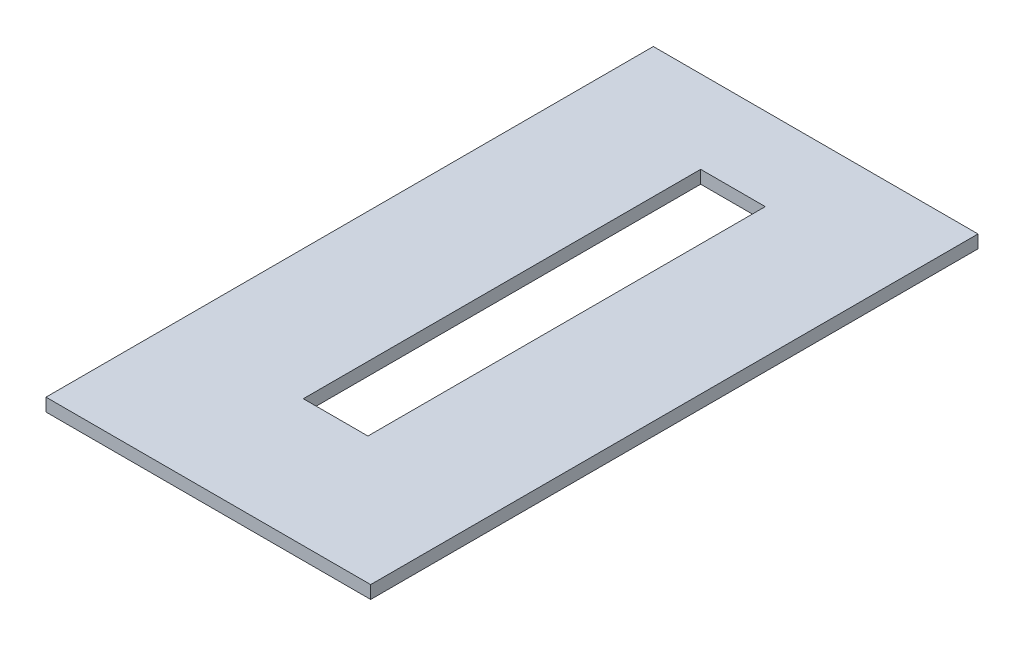
ISO-10303-21;
HEADER;
FILE_DESCRIPTION(('STEP AP214'),'2;1');
FILE_NAME('part.step','',(''),(''),'','','');
FILE_SCHEMA(('AUTOMOTIVE_DESIGN { 1 0 10303 214 1 1 1 1 }'));
ENDSEC;
DATA;
#1=APPLICATION_CONTEXT('core data for automotive mechanical design processes');
#2=APPLICATION_PROTOCOL_DEFINITION('international standard','automotive_design',2000,#1);
#3=PRODUCT_CONTEXT('',#1,'mechanical');
#4=PRODUCT('Part','Part','',(#3));
#5=PRODUCT_RELATED_PRODUCT_CATEGORY('part','',(#4));
#6=PRODUCT_DEFINITION_FORMATION('','',#4);
#7=PRODUCT_DEFINITION_CONTEXT('part definition',#1,'design');
#8=PRODUCT_DEFINITION('design','',#6,#7);
#9=PRODUCT_DEFINITION_SHAPE('','',#8);
#10=(LENGTH_UNIT() NAMED_UNIT(*) SI_UNIT(.MILLI.,.METRE.));
#11=(NAMED_UNIT(*) PLANE_ANGLE_UNIT() SI_UNIT($,.RADIAN.));
#12=(NAMED_UNIT(*) SI_UNIT($,.STERADIAN.) SOLID_ANGLE_UNIT());
#13=UNCERTAINTY_MEASURE_WITH_UNIT(LENGTH_MEASURE(1.E-05),#10,'distance_accuracy_value','');
#14=(GEOMETRIC_REPRESENTATION_CONTEXT(3) GLOBAL_UNCERTAINTY_ASSIGNED_CONTEXT((#13)) GLOBAL_UNIT_ASSIGNED_CONTEXT((#10,
#11,#12)) REPRESENTATION_CONTEXT('',''));
#15=CARTESIAN_POINT('',(0.,0.,0.));
#16=DIRECTION('',(0.,0.,1.));
#17=DIRECTION('',(1.,0.,0.));
#18=AXIS2_PLACEMENT_3D('',#15,#16,#17);
#19=CARTESIAN_POINT('',(-2512.49999999998,-200.,-4700.));
#20=DIRECTION('',(-1.,0.,0.));
#21=DIRECTION('',(0.,0.,1.));
#22=AXIS2_PLACEMENT_3D('',#19,#20,#21);
#23=PLANE('',#22);
#24=DIRECTION('',(0.,0.,1.));
#25=VECTOR('',#24,1.);
#26=CARTESIAN_POINT('',(-2512.49999999998,0.,-4700.));
#27=LINE('',#26,#25);
#28=CARTESIAN_POINT('',(-2512.49999999998,0.,-4700.));
#29=VERTEX_POINT('',#28);
#30=CARTESIAN_POINT('',(-2512.49999999998,0.,4700.));
#31=VERTEX_POINT('',#30);
#32=EDGE_CURVE('E148',#29,#31,#27,.T.);
#33=ORIENTED_EDGE('',*,*,#32,.F.);
#34=DIRECTION('',(0.,1.,0.));
#35=VECTOR('',#34,1.);
#36=CARTESIAN_POINT('',(-2512.49999999998,-200.,-4700.));
#37=LINE('',#36,#35);
#38=CARTESIAN_POINT('',(-2512.49999999998,-200.,-4700.));
#39=VERTEX_POINT('',#38);
#40=EDGE_CURVE('E11',#39,#29,#37,.T.);
#41=ORIENTED_EDGE('',*,*,#40,.F.);
#42=DIRECTION('',(0.,0.,1.));
#43=VECTOR('',#42,1.);
#44=CARTESIAN_POINT('',(-2512.49999999998,-200.,-4700.));
#45=LINE('',#44,#43);
#46=CARTESIAN_POINT('',(-2512.49999999998,-200.,4700.));
#47=VERTEX_POINT('',#46);
#48=EDGE_CURVE('E154',#39,#47,#45,.T.);
#49=ORIENTED_EDGE('',*,*,#48,.T.);
#50=DIRECTION('',(0.,1.,0.));
#51=VECTOR('',#50,1.);
#52=CARTESIAN_POINT('',(-2512.49999999998,-200.,4700.));
#53=LINE('',#52,#51);
#54=EDGE_CURVE('E41',#47,#31,#53,.T.);
#55=ORIENTED_EDGE('',*,*,#54,.T.);
#56=EDGE_LOOP('',(#33,#41,#49,#55));
#57=FACE_BOUND('',#56,.T.);
#58=ADVANCED_FACE('F38',(#57),#23,.T.);
#59=CARTESIAN_POINT('',(-2512.49999999998,-200.,-4700.));
#60=DIRECTION('',(0.,0.,-1.));
#61=DIRECTION('',(-1.,0.,0.));
#62=AXIS2_PLACEMENT_3D('',#59,#60,#61);
#63=PLANE('',#62);
#64=DIRECTION('',(-1.,0.,0.));
#65=VECTOR('',#64,1.);
#66=CARTESIAN_POINT('',(-2512.49999999998,0.,-4700.));
#67=LINE('',#66,#65);
#68=CARTESIAN_POINT('',(2512.5,0.,-4700.));
#69=VERTEX_POINT('',#68);
#70=EDGE_CURVE('E159',#69,#29,#67,.T.);
#71=ORIENTED_EDGE('',*,*,#70,.F.);
#72=DIRECTION('',(0.,1.,0.));
#73=VECTOR('',#72,1.);
#74=CARTESIAN_POINT('',(2512.5,-200.,-4700.));
#75=LINE('',#74,#73);
#76=CARTESIAN_POINT('',(2512.5,-200.,-4700.));
#77=VERTEX_POINT('',#76);
#78=EDGE_CURVE('E47',#77,#69,#75,.T.);
#79=ORIENTED_EDGE('',*,*,#78,.F.);
#80=DIRECTION('',(-1.,0.,0.));
#81=VECTOR('',#80,1.);
#82=CARTESIAN_POINT('',(-2512.49999999998,-200.,-4700.));
#83=LINE('',#82,#81);
#84=EDGE_CURVE('E167',#77,#39,#83,.T.);
#85=ORIENTED_EDGE('',*,*,#84,.T.);
#86=ORIENTED_EDGE('',*,*,#40,.T.);
#87=EDGE_LOOP('',(#71,#79,#85,#86));
#88=FACE_BOUND('',#87,.T.);
#89=ADVANCED_FACE('F203',(#88),#63,.T.);
#90=CARTESIAN_POINT('',(2512.5,-200.,-4700.));
#91=DIRECTION('',(1.,0.,0.));
#92=DIRECTION('',(0.,0.,-1.));
#93=AXIS2_PLACEMENT_3D('',#90,#91,#92);
#94=PLANE('',#93);
#95=DIRECTION('',(0.,0.,-1.));
#96=VECTOR('',#95,1.);
#97=CARTESIAN_POINT('',(2512.5,0.,-4700.));
#98=LINE('',#97,#96);
#99=CARTESIAN_POINT('',(2512.5,0.,4700.));
#100=VERTEX_POINT('',#99);
#101=EDGE_CURVE('E178',#100,#69,#98,.T.);
#102=ORIENTED_EDGE('',*,*,#101,.F.);
#103=DIRECTION('',(0.,1.,0.));
#104=VECTOR('',#103,1.);
#105=CARTESIAN_POINT('',(2512.5,-200.,4700.));
#106=LINE('',#105,#104);
#107=CARTESIAN_POINT('',(2512.5,-200.,4700.));
#108=VERTEX_POINT('',#107);
#109=EDGE_CURVE('E186',#108,#100,#106,.T.);
#110=ORIENTED_EDGE('',*,*,#109,.F.);
#111=DIRECTION('',(0.,0.,-1.));
#112=VECTOR('',#111,1.);
#113=CARTESIAN_POINT('',(2512.5,-200.,-4700.));
#114=LINE('',#113,#112);
#115=EDGE_CURVE('E163',#108,#77,#114,.T.);
#116=ORIENTED_EDGE('',*,*,#115,.T.);
#117=ORIENTED_EDGE('',*,*,#78,.T.);
#118=EDGE_LOOP('',(#102,#110,#116,#117));
#119=FACE_BOUND('',#118,.T.);
#120=ADVANCED_FACE('F207',(#119),#94,.T.);
#121=CARTESIAN_POINT('',(-2512.49999999998,-200.,4700.));
#122=DIRECTION('',(0.,0.,1.));
#123=DIRECTION('',(1.,0.,0.));
#124=AXIS2_PLACEMENT_3D('',#121,#122,#123);
#125=PLANE('',#124);
#126=DIRECTION('',(1.,0.,0.));
#127=VECTOR('',#126,1.);
#128=CARTESIAN_POINT('',(-2512.49999999998,0.,4700.));
#129=LINE('',#128,#127);
#130=EDGE_CURVE('E174',#31,#100,#129,.T.);
#131=ORIENTED_EDGE('',*,*,#130,.F.);
#132=ORIENTED_EDGE('',*,*,#54,.F.);
#133=DIRECTION('',(1.,0.,0.));
#134=VECTOR('',#133,1.);
#135=CARTESIAN_POINT('',(-2512.49999999998,-200.,4700.));
#136=LINE('',#135,#134);
#137=EDGE_CURVE('E158',#47,#108,#136,.T.);
#138=ORIENTED_EDGE('',*,*,#137,.T.);
#139=ORIENTED_EDGE('',*,*,#109,.T.);
#140=EDGE_LOOP('',(#131,#132,#138,#139));
#141=FACE_BOUND('',#140,.T.);
#142=ADVANCED_FACE('F198',(#141),#125,.T.);
#143=CARTESIAN_POINT('',(0.,-200.,0.));
#144=DIRECTION('',(0.,1.,0.));
#145=DIRECTION('',(0.,0.,1.));
#146=AXIS2_PLACEMENT_3D('',#143,#144,#145);
#147=PLANE('',#146);
#148=DIRECTION('',(1.,0.,0.));
#149=VECTOR('',#148,1.);
#150=CARTESIAN_POINT('',(500.,-200.,2729.99999999998));
#151=LINE('',#150,#149);
#152=CARTESIAN_POINT('',(-500.000000000002,-200.,2729.99999999998));
#153=VERTEX_POINT('',#152);
#154=CARTESIAN_POINT('',(500.,-200.,2729.99999999998));
#155=VERTEX_POINT('',#154);
#156=EDGE_CURVE('E113',#153,#155,#151,.T.);
#157=ORIENTED_EDGE('',*,*,#156,.T.);
#158=DIRECTION('',(0.,0.,-1.));
#159=VECTOR('',#158,1.);
#160=CARTESIAN_POINT('',(499.999999999999,-200.,-3420.));
#161=LINE('',#160,#159);
#162=CARTESIAN_POINT('',(499.999999999999,-200.,-3420.));
#163=VERTEX_POINT('',#162);
#164=EDGE_CURVE('E106',#155,#163,#161,.T.);
#165=ORIENTED_EDGE('',*,*,#164,.T.);
#166=DIRECTION('',(-1.,0.,0.));
#167=VECTOR('',#166,1.);
#168=CARTESIAN_POINT('',(499.999999999999,-200.,-3420.));
#169=LINE('',#168,#167);
#170=CARTESIAN_POINT('',(-500.000000000003,-200.,-3420.));
#171=VERTEX_POINT('',#170);
#172=EDGE_CURVE('E116',#163,#171,#169,.T.);
#173=ORIENTED_EDGE('',*,*,#172,.T.);
#174=DIRECTION('',(0.,0.,1.));
#175=VECTOR('',#174,1.);
#176=CARTESIAN_POINT('',(-500.000000000003,-200.,-3420.));
#177=LINE('',#176,#175);
#178=EDGE_CURVE('E55',#171,#153,#177,.T.);
#179=ORIENTED_EDGE('',*,*,#178,.T.);
#180=EDGE_LOOP('',(#157,#165,#173,#179));
#181=FACE_BOUND('',#180,.T.);
#182=ORIENTED_EDGE('',*,*,#48,.F.);
#183=ORIENTED_EDGE('',*,*,#84,.F.);
#184=ORIENTED_EDGE('',*,*,#115,.F.);
#185=ORIENTED_EDGE('',*,*,#137,.F.);
#186=EDGE_LOOP('',(#182,#183,#184,#185));
#187=FACE_BOUND('',#186,.T.);
#188=ADVANCED_FACE('F121',(#181,#187),#147,.F.);
#189=CARTESIAN_POINT('',(0.,0.,0.));
#190=DIRECTION('',(0.,1.,0.));
#191=DIRECTION('',(0.,0.,1.));
#192=AXIS2_PLACEMENT_3D('',#189,#190,#191);
#193=PLANE('',#192);
#194=DIRECTION('',(0.,0.,-1.));
#195=VECTOR('',#194,1.);
#196=CARTESIAN_POINT('',(499.999999999999,0.,-3420.));
#197=LINE('',#196,#195);
#198=CARTESIAN_POINT('',(500.,0.,2729.99999999998));
#199=VERTEX_POINT('',#198);
#200=CARTESIAN_POINT('',(499.999999999999,0.,-3420.));
#201=VERTEX_POINT('',#200);
#202=EDGE_CURVE('E63',#199,#201,#197,.T.);
#203=ORIENTED_EDGE('',*,*,#202,.F.);
#204=DIRECTION('',(1.,0.,0.));
#205=VECTOR('',#204,1.);
#206=CARTESIAN_POINT('',(500.,0.,2729.99999999998));
#207=LINE('',#206,#205);
#208=CARTESIAN_POINT('',(-500.000000000002,0.,2729.99999999998));
#209=VERTEX_POINT('',#208);
#210=EDGE_CURVE('E125',#209,#199,#207,.T.);
#211=ORIENTED_EDGE('',*,*,#210,.F.);
#212=DIRECTION('',(0.,0.,1.));
#213=VECTOR('',#212,1.);
#214=CARTESIAN_POINT('',(-500.000000000003,0.,-3420.));
#215=LINE('',#214,#213);
#216=CARTESIAN_POINT('',(-500.000000000003,0.,-3420.));
#217=VERTEX_POINT('',#216);
#218=EDGE_CURVE('E130',#217,#209,#215,.T.);
#219=ORIENTED_EDGE('',*,*,#218,.F.);
#220=DIRECTION('',(-1.,0.,0.));
#221=VECTOR('',#220,1.);
#222=CARTESIAN_POINT('',(499.999999999999,0.,-3420.));
#223=LINE('',#222,#221);
#224=EDGE_CURVE('E139',#201,#217,#223,.T.);
#225=ORIENTED_EDGE('',*,*,#224,.F.);
#226=EDGE_LOOP('',(#203,#211,#219,#225));
#227=FACE_BOUND('',#226,.T.);
#228=ORIENTED_EDGE('',*,*,#32,.T.);
#229=ORIENTED_EDGE('',*,*,#130,.T.);
#230=ORIENTED_EDGE('',*,*,#101,.T.);
#231=ORIENTED_EDGE('',*,*,#70,.T.);
#232=EDGE_LOOP('',(#228,#229,#230,#231));
#233=FACE_BOUND('',#232,.T.);
#234=ADVANCED_FACE('F200',(#227,#233),#193,.T.);
#235=CARTESIAN_POINT('',(499.999999999999,-200.,-3420.));
#236=DIRECTION('',(1.,0.,0.));
#237=DIRECTION('',(0.,0.,-1.));
#238=AXIS2_PLACEMENT_3D('',#235,#236,#237);
#239=PLANE('',#238);
#240=ORIENTED_EDGE('',*,*,#202,.T.);
#241=DIRECTION('',(0.,1.,0.));
#242=VECTOR('',#241,1.);
#243=CARTESIAN_POINT('',(499.999999999999,-200.,-3420.));
#244=LINE('',#243,#242);
#245=EDGE_CURVE('E102',#163,#201,#244,.T.);
#246=ORIENTED_EDGE('',*,*,#245,.F.);
#247=ORIENTED_EDGE('',*,*,#164,.F.);
#248=DIRECTION('',(0.,1.,0.));
#249=VECTOR('',#248,1.);
#250=CARTESIAN_POINT('',(500.,-200.,2729.99999999998));
#251=LINE('',#250,#249);
#252=EDGE_CURVE('E145',#155,#199,#251,.T.);
#253=ORIENTED_EDGE('',*,*,#252,.T.);
#254=EDGE_LOOP('',(#240,#246,#247,#253));
#255=FACE_BOUND('',#254,.T.);
#256=ADVANCED_FACE('F104',(#255),#239,.F.);
#257=CARTESIAN_POINT('',(500.,-200.,2729.99999999998));
#258=DIRECTION('',(0.,0.,1.));
#259=DIRECTION('',(1.,0.,0.));
#260=AXIS2_PLACEMENT_3D('',#257,#258,#259);
#261=PLANE('',#260);
#262=ORIENTED_EDGE('',*,*,#210,.T.);
#263=ORIENTED_EDGE('',*,*,#252,.F.);
#264=ORIENTED_EDGE('',*,*,#156,.F.);
#265=DIRECTION('',(0.,1.,0.));
#266=VECTOR('',#265,1.);
#267=CARTESIAN_POINT('',(-500.000000000002,-200.,2729.99999999998));
#268=LINE('',#267,#266);
#269=EDGE_CURVE('E149',#153,#209,#268,.T.);
#270=ORIENTED_EDGE('',*,*,#269,.T.);
#271=EDGE_LOOP('',(#262,#263,#264,#270));
#272=FACE_BOUND('',#271,.T.);
#273=ADVANCED_FACE('F258',(#272),#261,.F.);
#274=CARTESIAN_POINT('',(-500.000000000003,-200.,-3420.));
#275=DIRECTION('',(-1.,0.,0.));
#276=DIRECTION('',(0.,0.,1.));
#277=AXIS2_PLACEMENT_3D('',#274,#275,#276);
#278=PLANE('',#277);
#279=ORIENTED_EDGE('',*,*,#218,.T.);
#280=ORIENTED_EDGE('',*,*,#269,.F.);
#281=ORIENTED_EDGE('',*,*,#178,.F.);
#282=DIRECTION('',(0.,1.,0.));
#283=VECTOR('',#282,1.);
#284=CARTESIAN_POINT('',(-500.000000000003,-200.,-3420.));
#285=LINE('',#284,#283);
#286=EDGE_CURVE('E112',#171,#217,#285,.T.);
#287=ORIENTED_EDGE('',*,*,#286,.T.);
#288=EDGE_LOOP('',(#279,#280,#281,#287));
#289=FACE_BOUND('',#288,.T.);
#290=ADVANCED_FACE('F267',(#289),#278,.F.);
#291=CARTESIAN_POINT('',(499.999999999999,-200.,-3420.));
#292=DIRECTION('',(0.,0.,-1.));
#293=DIRECTION('',(-1.,0.,0.));
#294=AXIS2_PLACEMENT_3D('',#291,#292,#293);
#295=PLANE('',#294);
#296=ORIENTED_EDGE('',*,*,#224,.T.);
#297=ORIENTED_EDGE('',*,*,#286,.F.);
#298=ORIENTED_EDGE('',*,*,#172,.F.);
#299=ORIENTED_EDGE('',*,*,#245,.T.);
#300=EDGE_LOOP('',(#296,#297,#298,#299));
#301=FACE_BOUND('',#300,.T.);
#302=ADVANCED_FACE('F117',(#301),#295,.F.);
#303=CLOSED_SHELL('',(#58,#89,#120,#142,#188,#234,#256,#273,#290,#302));
#304=MANIFOLD_SOLID_BREP('B2',#303);
#305=ADVANCED_BREP_SHAPE_REPRESENTATION('',(#18,#304),#14);
#306=SHAPE_DEFINITION_REPRESENTATION(#9,#305);
ENDSEC;
END-ISO-10303-21;
